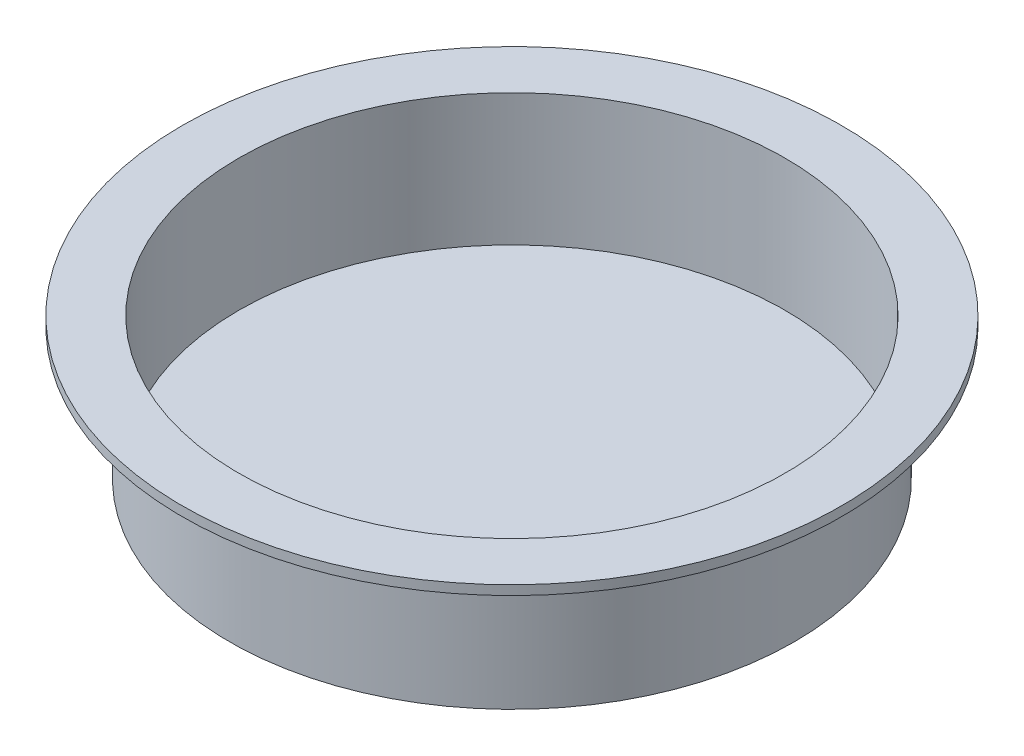
ISO-10303-21;
HEADER;
FILE_DESCRIPTION(('STEP AP214'),'2;1');
FILE_NAME('part.step','',(''),(''),'','','');
FILE_SCHEMA(('AUTOMOTIVE_DESIGN { 1 0 10303 214 1 1 1 1 }'));
ENDSEC;
DATA;
#1=APPLICATION_CONTEXT('core data for automotive mechanical design processes');
#2=APPLICATION_PROTOCOL_DEFINITION('international standard','automotive_design',2000,#1);
#3=PRODUCT_CONTEXT('',#1,'mechanical');
#4=PRODUCT('Part','Part','',(#3));
#5=PRODUCT_RELATED_PRODUCT_CATEGORY('part','',(#4));
#6=PRODUCT_DEFINITION_FORMATION('','',#4);
#7=PRODUCT_DEFINITION_CONTEXT('part definition',#1,'design');
#8=PRODUCT_DEFINITION('design','',#6,#7);
#9=PRODUCT_DEFINITION_SHAPE('','',#8);
#10=(LENGTH_UNIT() NAMED_UNIT(*) SI_UNIT(.MILLI.,.METRE.));
#11=(NAMED_UNIT(*) PLANE_ANGLE_UNIT() SI_UNIT($,.RADIAN.));
#12=(NAMED_UNIT(*) SI_UNIT($,.STERADIAN.) SOLID_ANGLE_UNIT());
#13=UNCERTAINTY_MEASURE_WITH_UNIT(LENGTH_MEASURE(1.E-05),#10,'distance_accuracy_value','');
#14=(GEOMETRIC_REPRESENTATION_CONTEXT(3) GLOBAL_UNCERTAINTY_ASSIGNED_CONTEXT((#13)) GLOBAL_UNIT_ASSIGNED_CONTEXT((#10,
#11,#12)) REPRESENTATION_CONTEXT('',''));
#15=CARTESIAN_POINT('',(0.,0.,0.));
#16=DIRECTION('',(0.,0.,1.));
#17=DIRECTION('',(1.,0.,0.));
#18=AXIS2_PLACEMENT_3D('',#15,#16,#17);
#19=CARTESIAN_POINT('',(0.,0.,0.));
#20=DIRECTION('',(0.,1.,0.));
#21=DIRECTION('',(-1.,0.,0.));
#22=AXIS2_PLACEMENT_3D('',#19,#20,#21);
#23=PLANE('',#22);
#24=CARTESIAN_POINT('',(0.,0.,0.));
#25=DIRECTION('',(0.,1.,0.));
#26=DIRECTION('',(-1.,0.,0.));
#27=AXIS2_PLACEMENT_3D('',#24,#25,#26);
#28=CIRCLE('',#27,38.1);
#29=CARTESIAN_POINT('',(-38.1,0.,0.));
#30=VERTEX_POINT('',#29);
#31=EDGE_CURVE('E10',#30,#30,#28,.T.);
#32=ORIENTED_EDGE('',*,*,#31,.F.);
#33=EDGE_LOOP('',(#32));
#34=FACE_BOUND('',#33,.T.);
#35=ADVANCED_FACE('F30',(#34),#23,.F.);
#36=CARTESIAN_POINT('',(0.,19.05,0.));
#37=DIRECTION('',(0.,1.,0.));
#38=DIRECTION('',(-1.,0.,0.));
#39=AXIS2_PLACEMENT_3D('',#36,#37,#38);
#40=CYLINDRICAL_SURFACE('',#39,38.1);
#41=CARTESIAN_POINT('',(0.,17.78,0.));
#42=DIRECTION('',(0.,1.,0.));
#43=DIRECTION('',(-1.,0.,0.));
#44=AXIS2_PLACEMENT_3D('',#41,#42,#43);
#45=CIRCLE('',#44,38.1);
#46=CARTESIAN_POINT('',(-38.1,17.78,0.));
#47=VERTEX_POINT('',#46);
#48=EDGE_CURVE('E36',#47,#47,#45,.T.);
#49=ORIENTED_EDGE('',*,*,#48,.F.);
#50=EDGE_LOOP('',(#49));
#51=FACE_BOUND('',#50,.T.);
#52=ORIENTED_EDGE('',*,*,#31,.T.);
#53=EDGE_LOOP('',(#52));
#54=FACE_BOUND('',#53,.T.);
#55=ADVANCED_FACE('F78',(#51,#54),#40,.T.);
#56=CARTESIAN_POINT('',(38.1,17.78,0.));
#57=DIRECTION('',(0.,1.,0.));
#58=DIRECTION('',(-1.,0.,0.));
#59=AXIS2_PLACEMENT_3D('',#56,#57,#58);
#60=PLANE('',#59);
#61=CARTESIAN_POINT('',(0.,17.78,0.));
#62=DIRECTION('',(0.,1.,0.));
#63=DIRECTION('',(-1.,0.,0.));
#64=AXIS2_PLACEMENT_3D('',#61,#62,#63);
#65=CIRCLE('',#64,44.45);
#66=CARTESIAN_POINT('',(-44.45,17.78,0.));
#67=VERTEX_POINT('',#66);
#68=EDGE_CURVE('E40',#67,#67,#65,.T.);
#69=ORIENTED_EDGE('',*,*,#68,.F.);
#70=EDGE_LOOP('',(#69));
#71=FACE_BOUND('',#70,.T.);
#72=ORIENTED_EDGE('',*,*,#48,.T.);
#73=EDGE_LOOP('',(#72));
#74=FACE_BOUND('',#73,.T.);
#75=ADVANCED_FACE('F73',(#71,#74),#60,.F.);
#76=CARTESIAN_POINT('',(0.,19.05,0.));
#77=DIRECTION('',(0.,1.,0.));
#78=DIRECTION('',(-1.,0.,0.));
#79=AXIS2_PLACEMENT_3D('',#76,#77,#78);
#80=CYLINDRICAL_SURFACE('',#79,44.45);
#81=CARTESIAN_POINT('',(0.,19.05,0.));
#82=DIRECTION('',(0.,1.,0.));
#83=DIRECTION('',(-1.,0.,0.));
#84=AXIS2_PLACEMENT_3D('',#81,#82,#83);
#85=CIRCLE('',#84,44.45);
#86=CARTESIAN_POINT('',(-44.45,19.05,0.));
#87=VERTEX_POINT('',#86);
#88=EDGE_CURVE('E44',#87,#87,#85,.T.);
#89=ORIENTED_EDGE('',*,*,#88,.F.);
#90=EDGE_LOOP('',(#89));
#91=FACE_BOUND('',#90,.T.);
#92=ORIENTED_EDGE('',*,*,#68,.T.);
#93=EDGE_LOOP('',(#92));
#94=FACE_BOUND('',#93,.T.);
#95=ADVANCED_FACE('F67',(#91,#94),#80,.T.);
#96=CARTESIAN_POINT('',(44.45,19.05,0.));
#97=DIRECTION('',(0.,-1.,0.));
#98=DIRECTION('',(1.,0.,0.));
#99=AXIS2_PLACEMENT_3D('',#96,#97,#98);
#100=PLANE('',#99);
#101=CARTESIAN_POINT('',(0.,19.05,0.));
#102=DIRECTION('',(0.,1.,0.));
#103=DIRECTION('',(-1.,0.,0.));
#104=AXIS2_PLACEMENT_3D('',#101,#102,#103);
#105=CIRCLE('',#104,36.83);
#106=CARTESIAN_POINT('',(-36.83,19.05,0.));
#107=VERTEX_POINT('',#106);
#108=EDGE_CURVE('E50',#107,#107,#105,.T.);
#109=ORIENTED_EDGE('',*,*,#108,.F.);
#110=EDGE_LOOP('',(#109));
#111=FACE_BOUND('',#110,.T.);
#112=ORIENTED_EDGE('',*,*,#88,.T.);
#113=EDGE_LOOP('',(#112));
#114=FACE_BOUND('',#113,.T.);
#115=ADVANCED_FACE('F61',(#111,#114),#100,.F.);
#116=CARTESIAN_POINT('',(0.,1.27,0.));
#117=DIRECTION('',(0.,1.,0.));
#118=DIRECTION('',(-1.,0.,0.));
#119=AXIS2_PLACEMENT_3D('',#116,#117,#118);
#120=CYLINDRICAL_SURFACE('',#119,36.83);
#121=CARTESIAN_POINT('',(0.,1.27,0.));
#122=DIRECTION('',(0.,1.,0.));
#123=DIRECTION('',(-1.,0.,0.));
#124=AXIS2_PLACEMENT_3D('',#121,#122,#123);
#125=CIRCLE('',#124,36.83);
#126=CARTESIAN_POINT('',(-36.83,1.27,0.));
#127=VERTEX_POINT('',#126);
#128=EDGE_CURVE('E49',#127,#127,#125,.T.);
#129=ORIENTED_EDGE('',*,*,#128,.F.);
#130=EDGE_LOOP('',(#129));
#131=FACE_BOUND('',#130,.T.);
#132=ORIENTED_EDGE('',*,*,#108,.T.);
#133=EDGE_LOOP('',(#132));
#134=FACE_BOUND('',#133,.T.);
#135=ADVANCED_FACE('F58',(#131,#134),#120,.F.);
#136=CARTESIAN_POINT('',(0.,1.27,0.));
#137=DIRECTION('',(0.,1.,0.));
#138=DIRECTION('',(-1.,0.,0.));
#139=AXIS2_PLACEMENT_3D('',#136,#137,#138);
#140=PLANE('',#139);
#141=ORIENTED_EDGE('',*,*,#128,.T.);
#142=EDGE_LOOP('',(#141));
#143=FACE_BOUND('',#142,.T.);
#144=ADVANCED_FACE('F56',(#143),#140,.T.);
#145=CLOSED_SHELL('',(#35,#55,#75,#95,#115,#135,#144));
#146=MANIFOLD_SOLID_BREP('B2',#145);
#147=ADVANCED_BREP_SHAPE_REPRESENTATION('',(#18,#146),#14);
#148=SHAPE_DEFINITION_REPRESENTATION(#9,#147);
ENDSEC;
END-ISO-10303-21;
